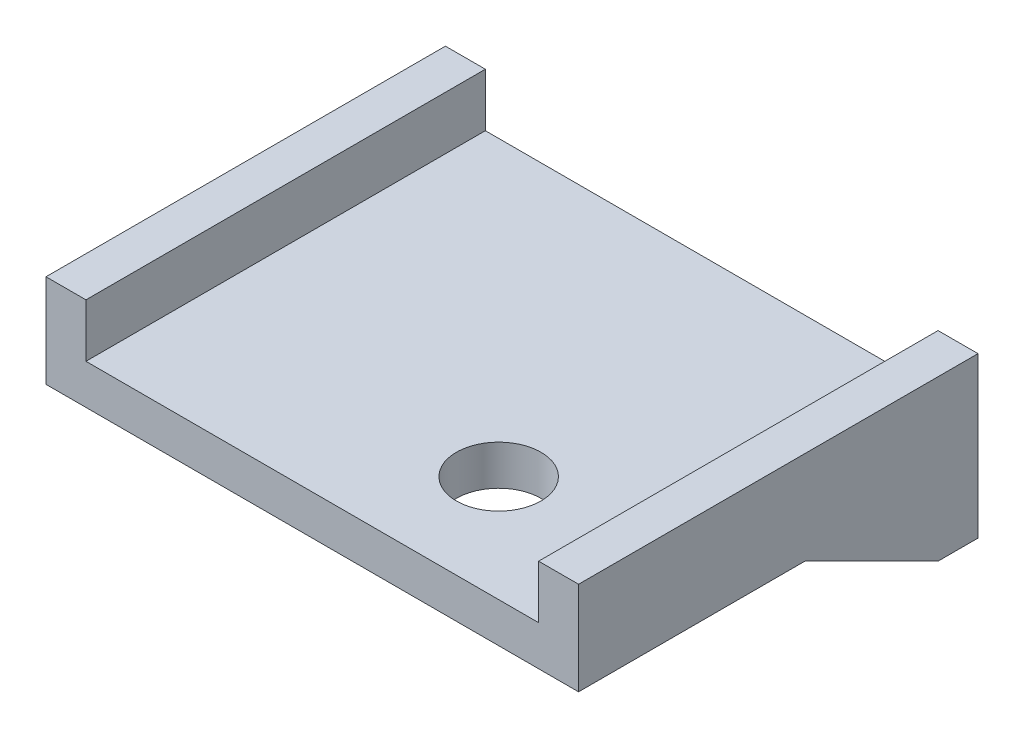
ISO-10303-21;
HEADER;
FILE_DESCRIPTION(('STEP AP214'),'2;1');
FILE_NAME('part.step','',(''),(''),'','','');
FILE_SCHEMA(('AUTOMOTIVE_DESIGN { 1 0 10303 214 1 1 1 1 }'));
ENDSEC;
DATA;
#1=APPLICATION_CONTEXT('core data for automotive mechanical design processes');
#2=APPLICATION_PROTOCOL_DEFINITION('international standard','automotive_design',2000,#1);
#3=PRODUCT_CONTEXT('',#1,'mechanical');
#4=PRODUCT('Part','Part','',(#3));
#5=PRODUCT_RELATED_PRODUCT_CATEGORY('part','',(#4));
#6=PRODUCT_DEFINITION_FORMATION('','',#4);
#7=PRODUCT_DEFINITION_CONTEXT('part definition',#1,'design');
#8=PRODUCT_DEFINITION('design','',#6,#7);
#9=PRODUCT_DEFINITION_SHAPE('','',#8);
#10=(LENGTH_UNIT() NAMED_UNIT(*) SI_UNIT(.MILLI.,.METRE.));
#11=(NAMED_UNIT(*) PLANE_ANGLE_UNIT() SI_UNIT($,.RADIAN.));
#12=(NAMED_UNIT(*) SI_UNIT($,.STERADIAN.) SOLID_ANGLE_UNIT());
#13=UNCERTAINTY_MEASURE_WITH_UNIT(LENGTH_MEASURE(1.E-05),#10,'distance_accuracy_value','');
#14=(GEOMETRIC_REPRESENTATION_CONTEXT(3) GLOBAL_UNCERTAINTY_ASSIGNED_CONTEXT((#13)) GLOBAL_UNIT_ASSIGNED_CONTEXT((#10,
#11,#12)) REPRESENTATION_CONTEXT('',''));
#15=CARTESIAN_POINT('',(0.,0.,0.));
#16=DIRECTION('',(0.,0.,1.));
#17=DIRECTION('',(1.,0.,0.));
#18=AXIS2_PLACEMENT_3D('',#15,#16,#17);
#19=CARTESIAN_POINT('',(0.521586434823383,-5.,-12.1925355573854));
#20=DIRECTION('',(0.,0.,-1.));
#21=DIRECTION('',(-1.,0.,0.));
#22=AXIS2_PLACEMENT_3D('',#19,#20,#21);
#23=PLANE('',#22);
#24=DIRECTION('',(0.,1.,0.));
#25=VECTOR('',#24,1.);
#26=CARTESIAN_POINT('',(-36.4784135651766,-5.,-12.1925355573854));
#27=LINE('',#26,#25);
#28=CARTESIAN_POINT('',(-36.4784135651766,-5.,-12.1925355573854));
#29=VERTEX_POINT('',#28);
#30=CARTESIAN_POINT('',(-36.4784135651766,0.,-12.1925355573854));
#31=VERTEX_POINT('',#30);
#32=EDGE_CURVE('E151',#29,#31,#27,.T.);
#33=ORIENTED_EDGE('',*,*,#32,.F.);
#34=DIRECTION('',(-1.,0.,0.));
#35=VECTOR('',#34,1.);
#36=CARTESIAN_POINT('',(0.521586434823383,-5.,-12.1925355573854));
#37=LINE('',#36,#35);
#38=CARTESIAN_POINT('',(-2.47841356517662,-5.,-12.1925355573854));
#39=VERTEX_POINT('',#38);
#40=EDGE_CURVE('E144',#39,#29,#37,.T.);
#41=ORIENTED_EDGE('',*,*,#40,.F.);
#42=DIRECTION('',(0.,1.,0.));
#43=VECTOR('',#42,1.);
#44=CARTESIAN_POINT('',(-2.47841356517662,-5.,-12.1925355573854));
#45=LINE('',#44,#43);
#46=CARTESIAN_POINT('',(-2.47841356517662,0.,-12.1925355573854));
#47=VERTEX_POINT('',#46);
#48=EDGE_CURVE('E406',#39,#47,#45,.T.);
#49=ORIENTED_EDGE('',*,*,#48,.T.);
#50=DIRECTION('',(-1.,0.,0.));
#51=VECTOR('',#50,1.);
#52=CARTESIAN_POINT('',(0.521586434823383,0.,-12.1925355573854));
#53=LINE('',#52,#51);
#54=EDGE_CURVE('E161',#47,#31,#53,.T.);
#55=ORIENTED_EDGE('',*,*,#54,.T.);
#56=EDGE_LOOP('',(#33,#41,#49,#55));
#57=FACE_BOUND('',#56,.T.);
#58=ADVANCED_FACE('F33',(#57),#23,.F.);
#59=CARTESIAN_POINT('',(0.,0.,0.));
#60=DIRECTION('',(0.,1.,0.));
#61=DIRECTION('',(0.,0.,1.));
#62=AXIS2_PLACEMENT_3D('',#59,#60,#61);
#63=PLANE('',#62);
#64=CARTESIAN_POINT('',(-13.4784135651766,0.,6.80746444261462));
#65=DIRECTION('',(0.,1.,0.));
#66=DIRECTION('',(0.,0.,1.));
#67=AXIS2_PLACEMENT_3D('',#64,#65,#66);
#68=CIRCLE('',#67,3.175);
#69=CARTESIAN_POINT('',(-13.4784135651766,0.,9.98246444261462));
#70=VERTEX_POINT('',#69);
#71=EDGE_CURVE('E175',#70,#70,#68,.T.);
#72=ORIENTED_EDGE('',*,*,#71,.T.);
#73=EDGE_LOOP('',(#72));
#74=FACE_BOUND('',#73,.T.);
#75=DIRECTION('',(0.,0.,1.));
#76=VECTOR('',#75,1.);
#77=CARTESIAN_POINT('',(-39.4784135651766,0.,-15.1925355573854));
#78=LINE('',#77,#76);
#79=CARTESIAN_POINT('',(-39.4784135651766,0.,-2.19253555738538));
#80=VERTEX_POINT('',#79);
#81=CARTESIAN_POINT('',(-39.4784135651766,0.,14.8074644426146));
#82=VERTEX_POINT('',#81);
#83=EDGE_CURVE('E37',#80,#82,#78,.T.);
#84=ORIENTED_EDGE('',*,*,#83,.F.);
#85=DIRECTION('',(1.,0.,0.));
#86=VECTOR('',#85,1.);
#87=CARTESIAN_POINT('',(0.,0.,-2.19253555738538));
#88=LINE('',#87,#86);
#89=CARTESIAN_POINT('',(-36.4784135651766,0.,-2.19253555738538));
#90=VERTEX_POINT('',#89);
#91=EDGE_CURVE('E412',#80,#90,#88,.T.);
#92=ORIENTED_EDGE('',*,*,#91,.T.);
#93=DIRECTION('',(0.,0.,1.));
#94=VECTOR('',#93,1.);
#95=CARTESIAN_POINT('',(-36.4784135651766,0.,0.));
#96=LINE('',#95,#94);
#97=EDGE_CURVE('E153',#31,#90,#96,.T.);
#98=ORIENTED_EDGE('',*,*,#97,.F.);
#99=ORIENTED_EDGE('',*,*,#54,.F.);
#100=DIRECTION('',(0.,0.,1.));
#101=VECTOR('',#100,1.);
#102=CARTESIAN_POINT('',(-2.47841356517662,0.,0.));
#103=LINE('',#102,#101);
#104=CARTESIAN_POINT('',(-2.47841356517662,0.,-2.19253555738538));
#105=VERTEX_POINT('',#104);
#106=EDGE_CURVE('E405',#47,#105,#103,.T.);
#107=ORIENTED_EDGE('',*,*,#106,.T.);
#108=DIRECTION('',(1.,0.,0.));
#109=VECTOR('',#108,1.);
#110=CARTESIAN_POINT('',(0.,0.,-2.19253555738538));
#111=LINE('',#110,#109);
#112=CARTESIAN_POINT('',(0.521586434823384,0.,-2.19253555738538));
#113=VERTEX_POINT('',#112);
#114=EDGE_CURVE('E178',#105,#113,#111,.T.);
#115=ORIENTED_EDGE('',*,*,#114,.T.);
#116=DIRECTION('',(0.,0.,-1.));
#117=VECTOR('',#116,1.);
#118=CARTESIAN_POINT('',(0.521586434823383,0.,-15.1925355573854));
#119=LINE('',#118,#117);
#120=CARTESIAN_POINT('',(0.52158643482339,0.,14.8074644426146));
#121=VERTEX_POINT('',#120);
#122=EDGE_CURVE('E179',#121,#113,#119,.T.);
#123=ORIENTED_EDGE('',*,*,#122,.F.);
#124=DIRECTION('',(1.,0.,0.));
#125=VECTOR('',#124,1.);
#126=CARTESIAN_POINT('',(-39.4784135651766,0.,14.8074644426146));
#127=LINE('',#126,#125);
#128=EDGE_CURVE('E184',#82,#121,#127,.T.);
#129=ORIENTED_EDGE('',*,*,#128,.F.);
#130=EDGE_LOOP('',(#84,#92,#98,#99,#107,#115,#123,#129));
#131=FACE_BOUND('',#130,.T.);
#132=ADVANCED_FACE('F239',(#74,#131),#63,.F.);
#133=CARTESIAN_POINT('',(0.,3.,0.));
#134=DIRECTION('',(0.,1.,0.));
#135=DIRECTION('',(0.,0.,1.));
#136=AXIS2_PLACEMENT_3D('',#133,#134,#135);
#137=PLANE('',#136);
#138=CARTESIAN_POINT('',(-13.4784135651766,3.,6.80746444261462));
#139=DIRECTION('',(0.,1.,0.));
#140=DIRECTION('',(0.,0.,1.));
#141=AXIS2_PLACEMENT_3D('',#138,#139,#140);
#142=CIRCLE('',#141,3.175);
#143=CARTESIAN_POINT('',(-13.4784135651766,3.,9.98246444261462));
#144=VERTEX_POINT('',#143);
#145=EDGE_CURVE('E172',#144,#144,#142,.T.);
#146=ORIENTED_EDGE('',*,*,#145,.F.);
#147=EDGE_LOOP('',(#146));
#148=FACE_BOUND('',#147,.T.);
#149=DIRECTION('',(-1.,0.,0.));
#150=VECTOR('',#149,1.);
#151=CARTESIAN_POINT('',(-39.4784135651766,3.,-15.1925355573854));
#152=LINE('',#151,#150);
#153=CARTESIAN_POINT('',(-2.47841356517661,3.,-15.1925355573854));
#154=VERTEX_POINT('',#153);
#155=CARTESIAN_POINT('',(-36.4784135651766,3.,-15.1925355573854));
#156=VERTEX_POINT('',#155);
#157=EDGE_CURVE('E193',#154,#156,#152,.T.);
#158=ORIENTED_EDGE('',*,*,#157,.T.);
#159=DIRECTION('',(0.,0.,-1.));
#160=VECTOR('',#159,1.);
#161=CARTESIAN_POINT('',(-36.4784135651766,3.,-15.1925355573854));
#162=LINE('',#161,#160);
#163=CARTESIAN_POINT('',(-36.4784135651766,3.,14.8074644426146));
#164=VERTEX_POINT('',#163);
#165=EDGE_CURVE('E59',#164,#156,#162,.T.);
#166=ORIENTED_EDGE('',*,*,#165,.F.);
#167=DIRECTION('',(1.,0.,0.));
#168=VECTOR('',#167,1.);
#169=CARTESIAN_POINT('',(-39.4784135651766,3.,14.8074644426146));
#170=LINE('',#169,#168);
#171=CARTESIAN_POINT('',(-2.47841356517661,3.,14.8074644426146));
#172=VERTEX_POINT('',#171);
#173=EDGE_CURVE('E183',#164,#172,#170,.T.);
#174=ORIENTED_EDGE('',*,*,#173,.T.);
#175=DIRECTION('',(0.,0.,1.));
#176=VECTOR('',#175,1.);
#177=CARTESIAN_POINT('',(-2.47841356517662,3.,-15.1925355573854));
#178=LINE('',#177,#176);
#179=EDGE_CURVE('E200',#154,#172,#178,.T.);
#180=ORIENTED_EDGE('',*,*,#179,.F.);
#181=EDGE_LOOP('',(#158,#166,#174,#180));
#182=FACE_BOUND('',#181,.T.);
#183=ADVANCED_FACE('F260',(#148,#182),#137,.T.);
#184=CARTESIAN_POINT('',(-39.4784135651766,3.,-15.1925355573854));
#185=DIRECTION('',(1.,0.,0.));
#186=DIRECTION('',(0.,0.,-1.));
#187=AXIS2_PLACEMENT_3D('',#184,#185,#186);
#188=PLANE('',#187);
#189=DIRECTION('',(0.,0.447213595499958,0.894427190999916));
#190=VECTOR('',#189,1.);
#191=CARTESIAN_POINT('',(-39.4784135651766,-5.,-12.1925355573854));
#192=LINE('',#191,#190);
#193=CARTESIAN_POINT('',(-39.4784135651766,-5.,-12.1925355573854));
#194=VERTEX_POINT('',#193);
#195=EDGE_CURVE('E139',#194,#80,#192,.T.);
#196=ORIENTED_EDGE('',*,*,#195,.T.);
#197=ORIENTED_EDGE('',*,*,#83,.T.);
#198=DIRECTION('',(0.,-1.,0.));
#199=VECTOR('',#198,1.);
#200=CARTESIAN_POINT('',(-39.4784135651766,3.,14.8074644426146));
#201=LINE('',#200,#199);
#202=CARTESIAN_POINT('',(-39.4784135651766,7.,14.8074644426146));
#203=VERTEX_POINT('',#202);
#204=EDGE_CURVE('E11',#203,#82,#201,.T.);
#205=ORIENTED_EDGE('',*,*,#204,.F.);
#206=DIRECTION('',(0.,0.,1.));
#207=VECTOR('',#206,1.);
#208=CARTESIAN_POINT('',(-39.4784135651766,7.,-15.1925355573854));
#209=LINE('',#208,#207);
#210=CARTESIAN_POINT('',(-39.4784135651766,7.,-15.1925355573854));
#211=VERTEX_POINT('',#210);
#212=EDGE_CURVE('E226',#211,#203,#209,.T.);
#213=ORIENTED_EDGE('',*,*,#212,.F.);
#214=DIRECTION('',(0.,-1.,0.));
#215=VECTOR('',#214,1.);
#216=CARTESIAN_POINT('',(-39.4784135651766,3.,-15.1925355573854));
#217=LINE('',#216,#215);
#218=CARTESIAN_POINT('',(-39.4784135651766,-5.,-15.1925355573854));
#219=VERTEX_POINT('',#218);
#220=EDGE_CURVE('E190',#211,#219,#217,.T.);
#221=ORIENTED_EDGE('',*,*,#220,.T.);
#222=DIRECTION('',(0.,0.,-1.));
#223=VECTOR('',#222,1.);
#224=CARTESIAN_POINT('',(-39.4784135651766,-5.,-15.1925355573854));
#225=LINE('',#224,#223);
#226=EDGE_CURVE('E165',#194,#219,#225,.T.);
#227=ORIENTED_EDGE('',*,*,#226,.F.);
#228=EDGE_LOOP('',(#196,#197,#205,#213,#221,#227));
#229=FACE_BOUND('',#228,.T.);
#230=ADVANCED_FACE('F35',(#229),#188,.F.);
#231=CARTESIAN_POINT('',(-39.4784135651766,3.,14.8074644426146));
#232=DIRECTION('',(0.,0.,-1.));
#233=DIRECTION('',(-1.,0.,0.));
#234=AXIS2_PLACEMENT_3D('',#231,#232,#233);
#235=PLANE('',#234);
#236=ORIENTED_EDGE('',*,*,#128,.T.);
#237=DIRECTION('',(0.,-1.,0.));
#238=VECTOR('',#237,1.);
#239=CARTESIAN_POINT('',(0.52158643482339,3.,14.8074644426146));
#240=LINE('',#239,#238);
#241=CARTESIAN_POINT('',(0.521586434823387,7.,14.8074644426146));
#242=VERTEX_POINT('',#241);
#243=EDGE_CURVE('E43',#242,#121,#240,.T.);
#244=ORIENTED_EDGE('',*,*,#243,.F.);
#245=DIRECTION('',(1.,0.,0.));
#246=VECTOR('',#245,1.);
#247=CARTESIAN_POINT('',(0.521586434823387,7.,14.8074644426146));
#248=LINE('',#247,#246);
#249=CARTESIAN_POINT('',(-2.47841356517661,7.,14.8074644426146));
#250=VERTEX_POINT('',#249);
#251=EDGE_CURVE('E208',#250,#242,#248,.T.);
#252=ORIENTED_EDGE('',*,*,#251,.F.);
#253=DIRECTION('',(0.,-1.,0.));
#254=VECTOR('',#253,1.);
#255=CARTESIAN_POINT('',(-2.47841356517661,7.,14.8074644426146));
#256=LINE('',#255,#254);
#257=EDGE_CURVE('E211',#250,#172,#256,.T.);
#258=ORIENTED_EDGE('',*,*,#257,.T.);
#259=ORIENTED_EDGE('',*,*,#173,.F.);
#260=DIRECTION('',(0.,-1.,0.));
#261=VECTOR('',#260,1.);
#262=CARTESIAN_POINT('',(-36.4784135651766,7.,14.8074644426146));
#263=LINE('',#262,#261);
#264=CARTESIAN_POINT('',(-36.4784135651766,7.,14.8074644426146));
#265=VERTEX_POINT('',#264);
#266=EDGE_CURVE('E218',#265,#164,#263,.T.);
#267=ORIENTED_EDGE('',*,*,#266,.F.);
#268=DIRECTION('',(1.,0.,0.));
#269=VECTOR('',#268,1.);
#270=CARTESIAN_POINT('',(-39.4784135651766,7.,14.8074644426146));
#271=LINE('',#270,#269);
#272=EDGE_CURVE('E231',#203,#265,#271,.T.);
#273=ORIENTED_EDGE('',*,*,#272,.F.);
#274=ORIENTED_EDGE('',*,*,#204,.T.);
#275=EDGE_LOOP('',(#236,#244,#252,#258,#259,#267,#273,#274));
#276=FACE_BOUND('',#275,.T.);
#277=ADVANCED_FACE('F335',(#276),#235,.F.);
#278=CARTESIAN_POINT('',(0.521586434823383,3.,-15.1925355573854));
#279=DIRECTION('',(-1.,0.,0.));
#280=DIRECTION('',(0.,0.,1.));
#281=AXIS2_PLACEMENT_3D('',#278,#279,#280);
#282=PLANE('',#281);
#283=ORIENTED_EDGE('',*,*,#122,.T.);
#284=DIRECTION('',(0.,0.447213595499958,0.894427190999916));
#285=VECTOR('',#284,1.);
#286=CARTESIAN_POINT('',(0.521586434823384,-5.,-12.1925355573854));
#287=LINE('',#286,#285);
#288=CARTESIAN_POINT('',(0.521586434823383,-5.,-12.1925355573854));
#289=VERTEX_POINT('',#288);
#290=EDGE_CURVE('E410',#289,#113,#287,.T.);
#291=ORIENTED_EDGE('',*,*,#290,.F.);
#292=DIRECTION('',(0.,0.,1.));
#293=VECTOR('',#292,1.);
#294=CARTESIAN_POINT('',(0.521586434823383,-5.,-15.1925355573854));
#295=LINE('',#294,#293);
#296=CARTESIAN_POINT('',(0.521586434823383,-5.,-15.1925355573854));
#297=VERTEX_POINT('',#296);
#298=EDGE_CURVE('E145',#297,#289,#295,.T.);
#299=ORIENTED_EDGE('',*,*,#298,.F.);
#300=DIRECTION('',(0.,-1.,0.));
#301=VECTOR('',#300,1.);
#302=CARTESIAN_POINT('',(0.521586434823383,3.,-15.1925355573854));
#303=LINE('',#302,#301);
#304=CARTESIAN_POINT('',(0.521586434823383,7.,-15.1925355573854));
#305=VERTEX_POINT('',#304);
#306=EDGE_CURVE('E192',#305,#297,#303,.T.);
#307=ORIENTED_EDGE('',*,*,#306,.F.);
#308=DIRECTION('',(0.,0.,-1.));
#309=VECTOR('',#308,1.);
#310=CARTESIAN_POINT('',(0.521586434823383,7.,-15.1925355573854));
#311=LINE('',#310,#309);
#312=EDGE_CURVE('E216',#242,#305,#311,.T.);
#313=ORIENTED_EDGE('',*,*,#312,.F.);
#314=ORIENTED_EDGE('',*,*,#243,.T.);
#315=EDGE_LOOP('',(#283,#291,#299,#307,#313,#314));
#316=FACE_BOUND('',#315,.T.);
#317=ADVANCED_FACE('F322',(#316),#282,.F.);
#318=CARTESIAN_POINT('',(-39.4784135651766,3.,-15.1925355573854));
#319=DIRECTION('',(0.,0.,1.));
#320=DIRECTION('',(1.,0.,0.));
#321=AXIS2_PLACEMENT_3D('',#318,#319,#320);
#322=PLANE('',#321);
#323=DIRECTION('',(0.,-1.,0.));
#324=VECTOR('',#323,1.);
#325=CARTESIAN_POINT('',(-36.4784135651766,7.,-15.1925355573854));
#326=LINE('',#325,#324);
#327=CARTESIAN_POINT('',(-36.4784135651766,7.,-15.1925355573854));
#328=VERTEX_POINT('',#327);
#329=EDGE_CURVE('E221',#328,#156,#326,.T.);
#330=ORIENTED_EDGE('',*,*,#329,.T.);
#331=ORIENTED_EDGE('',*,*,#157,.F.);
#332=DIRECTION('',(0.,-1.,0.));
#333=VECTOR('',#332,1.);
#334=CARTESIAN_POINT('',(-2.47841356517662,7.,-15.1925355573854));
#335=LINE('',#334,#333);
#336=CARTESIAN_POINT('',(-2.47841356517662,7.,-15.1925355573854));
#337=VERTEX_POINT('',#336);
#338=EDGE_CURVE('E416',#337,#154,#335,.T.);
#339=ORIENTED_EDGE('',*,*,#338,.F.);
#340=DIRECTION('',(-1.,0.,0.));
#341=VECTOR('',#340,1.);
#342=CARTESIAN_POINT('',(0.521586434823383,7.,-15.1925355573854));
#343=LINE('',#342,#341);
#344=EDGE_CURVE('E214',#305,#337,#343,.T.);
#345=ORIENTED_EDGE('',*,*,#344,.F.);
#346=ORIENTED_EDGE('',*,*,#306,.T.);
#347=DIRECTION('',(1.,0.,0.));
#348=VECTOR('',#347,1.);
#349=CARTESIAN_POINT('',(0.521586434823383,-5.,-15.1925355573854));
#350=LINE('',#349,#348);
#351=EDGE_CURVE('E170',#219,#297,#350,.T.);
#352=ORIENTED_EDGE('',*,*,#351,.F.);
#353=ORIENTED_EDGE('',*,*,#220,.F.);
#354=DIRECTION('',(-1.,0.,0.));
#355=VECTOR('',#354,1.);
#356=CARTESIAN_POINT('',(-39.4784135651766,7.,-15.1925355573854));
#357=LINE('',#356,#355);
#358=EDGE_CURVE('E224',#328,#211,#357,.T.);
#359=ORIENTED_EDGE('',*,*,#358,.F.);
#360=EDGE_LOOP('',(#330,#331,#339,#345,#346,#352,#353,#359));
#361=FACE_BOUND('',#360,.T.);
#362=ADVANCED_FACE('F317',(#361),#322,.F.);
#363=CARTESIAN_POINT('',(-2.47841356517662,7.,-15.1925355573854));
#364=DIRECTION('',(1.,0.,0.));
#365=DIRECTION('',(0.,0.,-1.));
#366=AXIS2_PLACEMENT_3D('',#363,#364,#365);
#367=PLANE('',#366);
#368=ORIENTED_EDGE('',*,*,#179,.T.);
#369=ORIENTED_EDGE('',*,*,#257,.F.);
#370=DIRECTION('',(0.,0.,1.));
#371=VECTOR('',#370,1.);
#372=CARTESIAN_POINT('',(-2.47841356517662,7.,-15.1925355573854));
#373=LINE('',#372,#371);
#374=EDGE_CURVE('E212',#337,#250,#373,.T.);
#375=ORIENTED_EDGE('',*,*,#374,.F.);
#376=ORIENTED_EDGE('',*,*,#338,.T.);
#377=EDGE_LOOP('',(#368,#369,#375,#376));
#378=FACE_BOUND('',#377,.T.);
#379=ADVANCED_FACE('F321',(#378),#367,.F.);
#380=CARTESIAN_POINT('',(0.,7.,0.));
#381=DIRECTION('',(0.,-1.,0.));
#382=DIRECTION('',(0.,0.,-1.));
#383=AXIS2_PLACEMENT_3D('',#380,#381,#382);
#384=PLANE('',#383);
#385=ORIENTED_EDGE('',*,*,#312,.T.);
#386=ORIENTED_EDGE('',*,*,#344,.T.);
#387=ORIENTED_EDGE('',*,*,#374,.T.);
#388=ORIENTED_EDGE('',*,*,#251,.T.);
#389=EDGE_LOOP('',(#385,#386,#387,#388));
#390=FACE_BOUND('',#389,.T.);
#391=ADVANCED_FACE('F309',(#390),#384,.F.);
#392=CARTESIAN_POINT('',(-36.4784135651766,7.,-15.1925355573854));
#393=DIRECTION('',(-1.,0.,0.));
#394=DIRECTION('',(0.,0.,1.));
#395=AXIS2_PLACEMENT_3D('',#392,#393,#394);
#396=PLANE('',#395);
#397=ORIENTED_EDGE('',*,*,#165,.T.);
#398=ORIENTED_EDGE('',*,*,#329,.F.);
#399=DIRECTION('',(0.,0.,-1.));
#400=VECTOR('',#399,1.);
#401=CARTESIAN_POINT('',(-36.4784135651766,7.,-15.1925355573854));
#402=LINE('',#401,#400);
#403=EDGE_CURVE('E229',#265,#328,#402,.T.);
#404=ORIENTED_EDGE('',*,*,#403,.F.);
#405=ORIENTED_EDGE('',*,*,#266,.T.);
#406=EDGE_LOOP('',(#397,#398,#404,#405));
#407=FACE_BOUND('',#406,.T.);
#408=ADVANCED_FACE('F252',(#407),#396,.F.);
#409=CARTESIAN_POINT('',(0.,7.,0.));
#410=DIRECTION('',(0.,1.,0.));
#411=DIRECTION('',(0.,0.,1.));
#412=AXIS2_PLACEMENT_3D('',#409,#410,#411);
#413=PLANE('',#412);
#414=ORIENTED_EDGE('',*,*,#403,.T.);
#415=ORIENTED_EDGE('',*,*,#358,.T.);
#416=ORIENTED_EDGE('',*,*,#212,.T.);
#417=ORIENTED_EDGE('',*,*,#272,.T.);
#418=EDGE_LOOP('',(#414,#415,#416,#417));
#419=FACE_BOUND('',#418,.T.);
#420=ADVANCED_FACE('F244',(#419),#413,.T.);
#421=CARTESIAN_POINT('',(-13.4784135651766,0.,6.80746444261462));
#422=DIRECTION('',(0.,1.,0.));
#423=DIRECTION('',(0.,0.,1.));
#424=AXIS2_PLACEMENT_3D('',#421,#422,#423);
#425=CYLINDRICAL_SURFACE('',#424,3.175);
#426=ORIENTED_EDGE('',*,*,#71,.F.);
#427=EDGE_LOOP('',(#426));
#428=FACE_BOUND('',#427,.T.);
#429=ORIENTED_EDGE('',*,*,#145,.T.);
#430=EDGE_LOOP('',(#429));
#431=FACE_BOUND('',#430,.T.);
#432=ADVANCED_FACE('F242',(#428,#431),#425,.F.);
#433=CARTESIAN_POINT('',(0.,-5.,0.));
#434=DIRECTION('',(0.,-1.,0.));
#435=DIRECTION('',(0.,0.,-1.));
#436=AXIS2_PLACEMENT_3D('',#433,#434,#435);
#437=PLANE('',#436);
#438=ORIENTED_EDGE('',*,*,#351,.T.);
#439=ORIENTED_EDGE('',*,*,#298,.T.);
#440=EDGE_CURVE('E147',#289,#39,#37,.T.);
#441=ORIENTED_EDGE('',*,*,#440,.T.);
#442=ORIENTED_EDGE('',*,*,#40,.T.);
#443=EDGE_CURVE('E133',#29,#194,#37,.T.);
#444=ORIENTED_EDGE('',*,*,#443,.T.);
#445=ORIENTED_EDGE('',*,*,#226,.T.);
#446=EDGE_LOOP('',(#438,#439,#441,#442,#444,#445));
#447=FACE_BOUND('',#446,.T.);
#448=ADVANCED_FACE('F163',(#447),#437,.T.);
#449=CARTESIAN_POINT('',(0.521586434823384,-5.,-12.1925355573854));
#450=DIRECTION('',(0.,-0.894427190999916,0.447213595499958));
#451=DIRECTION('',(0.,0.447213595499958,0.894427190999916));
#452=AXIS2_PLACEMENT_3D('',#449,#450,#451);
#453=PLANE('',#452);
#454=ORIENTED_EDGE('',*,*,#114,.F.);
#455=DIRECTION('',(0.,0.447213595499958,0.894427190999916));
#456=VECTOR('',#455,1.);
#457=CARTESIAN_POINT('',(-2.47841356517662,-5.,-12.1925355573854));
#458=LINE('',#457,#456);
#459=EDGE_CURVE('E51',#39,#105,#458,.T.);
#460=ORIENTED_EDGE('',*,*,#459,.F.);
#461=ORIENTED_EDGE('',*,*,#440,.F.);
#462=ORIENTED_EDGE('',*,*,#290,.T.);
#463=EDGE_LOOP('',(#454,#460,#461,#462));
#464=FACE_BOUND('',#463,.T.);
#465=ADVANCED_FACE('F250',(#464),#453,.T.);
#466=CARTESIAN_POINT('',(-2.47841356517662,1.,-0.192535557385382));
#467=DIRECTION('',(-1.,0.,0.));
#468=DIRECTION('',(0.,0.,1.));
#469=AXIS2_PLACEMENT_3D('',#466,#467,#468);
#470=PLANE('',#469);
#471=ORIENTED_EDGE('',*,*,#459,.T.);
#472=ORIENTED_EDGE('',*,*,#106,.F.);
#473=ORIENTED_EDGE('',*,*,#48,.F.);
#474=EDGE_LOOP('',(#471,#472,#473));
#475=FACE_BOUND('',#474,.T.);
#476=ADVANCED_FACE('F265',(#475),#470,.T.);
#477=CARTESIAN_POINT('',(-39.4784135651766,-5.,-12.1925355573854));
#478=DIRECTION('',(0.,-0.894427190999916,0.447213595499958));
#479=DIRECTION('',(0.,0.447213595499958,0.894427190999916));
#480=AXIS2_PLACEMENT_3D('',#477,#478,#479);
#481=PLANE('',#480);
#482=ORIENTED_EDGE('',*,*,#91,.F.);
#483=ORIENTED_EDGE('',*,*,#195,.F.);
#484=ORIENTED_EDGE('',*,*,#443,.F.);
#485=DIRECTION('',(0.,0.447213595499958,0.894427190999916));
#486=VECTOR('',#485,1.);
#487=CARTESIAN_POINT('',(-36.4784135651766,-5.,-12.1925355573854));
#488=LINE('',#487,#486);
#489=EDGE_CURVE('E136',#29,#90,#488,.T.);
#490=ORIENTED_EDGE('',*,*,#489,.T.);
#491=EDGE_LOOP('',(#482,#483,#484,#490));
#492=FACE_BOUND('',#491,.T.);
#493=ADVANCED_FACE('F135',(#492),#481,.T.);
#494=CARTESIAN_POINT('',(-36.4784135651766,1.,-0.192535557385382));
#495=DIRECTION('',(-1.,0.,0.));
#496=DIRECTION('',(0.,0.,1.));
#497=AXIS2_PLACEMENT_3D('',#494,#495,#496);
#498=PLANE('',#497);
#499=ORIENTED_EDGE('',*,*,#32,.T.);
#500=ORIENTED_EDGE('',*,*,#97,.T.);
#501=ORIENTED_EDGE('',*,*,#489,.F.);
#502=EDGE_LOOP('',(#499,#500,#501));
#503=FACE_BOUND('',#502,.T.);
#504=ADVANCED_FACE('F150',(#503),#498,.F.);
#505=CLOSED_SHELL('',(#58,#132,#183,#230,#277,#317,#362,#379,#391,#408,#420,#432,#448,#465,#476,
#493,#504));
#506=MANIFOLD_SOLID_BREP('B2',#505);
#507=ADVANCED_BREP_SHAPE_REPRESENTATION('',(#18,#506),#14);
#508=SHAPE_DEFINITION_REPRESENTATION(#9,#507);
ENDSEC;
END-ISO-10303-21;
